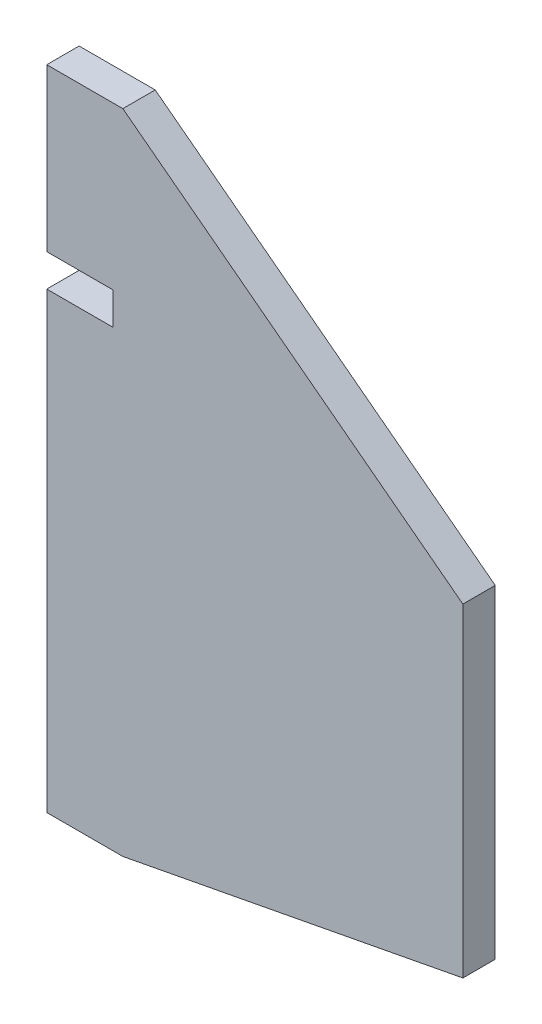
ISO-10303-21;
HEADER;
FILE_DESCRIPTION(('STEP AP214'),'2;1');
FILE_NAME('part.step','',(''),(''),'','','');
FILE_SCHEMA(('AUTOMOTIVE_DESIGN { 1 0 10303 214 1 1 1 1 }'));
ENDSEC;
DATA;
#1=APPLICATION_CONTEXT('core data for automotive mechanical design processes');
#2=APPLICATION_PROTOCOL_DEFINITION('international standard','automotive_design',2000,#1);
#3=PRODUCT_CONTEXT('',#1,'mechanical');
#4=PRODUCT('Part','Part','',(#3));
#5=PRODUCT_RELATED_PRODUCT_CATEGORY('part','',(#4));
#6=PRODUCT_DEFINITION_FORMATION('','',#4);
#7=PRODUCT_DEFINITION_CONTEXT('part definition',#1,'design');
#8=PRODUCT_DEFINITION('design','',#6,#7);
#9=PRODUCT_DEFINITION_SHAPE('','',#8);
#10=(LENGTH_UNIT() NAMED_UNIT(*) SI_UNIT(.MILLI.,.METRE.));
#11=(NAMED_UNIT(*) PLANE_ANGLE_UNIT() SI_UNIT($,.RADIAN.));
#12=(NAMED_UNIT(*) SI_UNIT($,.STERADIAN.) SOLID_ANGLE_UNIT());
#13=UNCERTAINTY_MEASURE_WITH_UNIT(LENGTH_MEASURE(1.E-05),#10,'distance_accuracy_value','');
#14=(GEOMETRIC_REPRESENTATION_CONTEXT(3) GLOBAL_UNCERTAINTY_ASSIGNED_CONTEXT((#13)) GLOBAL_UNIT_ASSIGNED_CONTEXT((#10,
#11,#12)) REPRESENTATION_CONTEXT('',''));
#15=CARTESIAN_POINT('',(0.,0.,0.));
#16=DIRECTION('',(0.,0.,1.));
#17=DIRECTION('',(1.,0.,0.));
#18=AXIS2_PLACEMENT_3D('',#15,#16,#17);
#19=CARTESIAN_POINT('',(0.,101.6,5.08));
#20=DIRECTION('',(1.,0.,0.));
#21=DIRECTION('',(0.,0.,-1.));
#22=AXIS2_PLACEMENT_3D('',#19,#20,#21);
#23=PLANE('',#22);
#24=DIRECTION('',(0.,-1.,0.));
#25=VECTOR('',#24,1.);
#26=CARTESIAN_POINT('',(0.,101.6,0.));
#27=LINE('',#26,#25);
#28=CARTESIAN_POINT('',(0.,101.6,0.));
#29=VERTEX_POINT('',#28);
#30=CARTESIAN_POINT('',(0.,76.2,0.));
#31=VERTEX_POINT('',#30);
#32=EDGE_CURVE('E148',#29,#31,#27,.T.);
#33=ORIENTED_EDGE('',*,*,#32,.T.);
#34=DIRECTION('',(0.,0.,1.));
#35=VECTOR('',#34,1.);
#36=CARTESIAN_POINT('',(0.,76.2,0.));
#37=LINE('',#36,#35);
#38=CARTESIAN_POINT('',(0.,76.2,5.08));
#39=VERTEX_POINT('',#38);
#40=EDGE_CURVE('E189',#31,#39,#37,.T.);
#41=ORIENTED_EDGE('',*,*,#40,.T.);
#42=DIRECTION('',(0.,-1.,0.));
#43=VECTOR('',#42,1.);
#44=CARTESIAN_POINT('',(0.,101.6,5.08));
#45=LINE('',#44,#43);
#46=CARTESIAN_POINT('',(0.,101.6,5.08));
#47=VERTEX_POINT('',#46);
#48=EDGE_CURVE('E187',#47,#39,#45,.T.);
#49=ORIENTED_EDGE('',*,*,#48,.F.);
#50=DIRECTION('',(0.,0.,-1.));
#51=VECTOR('',#50,1.);
#52=CARTESIAN_POINT('',(0.,101.6,5.08));
#53=LINE('',#52,#51);
#54=EDGE_CURVE('E144',#47,#29,#53,.T.);
#55=ORIENTED_EDGE('',*,*,#54,.T.);
#56=EDGE_LOOP('',(#33,#41,#49,#55));
#57=FACE_BOUND('',#56,.T.);
#58=ADVANCED_FACE('F44',(#57),#23,.F.);
#59=CARTESIAN_POINT('',(0.,71.12,5.08));
#60=VERTEX_POINT('',#59);
#61=CARTESIAN_POINT('',(0.,0.,5.08));
#62=VERTEX_POINT('',#61);
#63=EDGE_CURVE('E104',#60,#62,#45,.T.);
#64=ORIENTED_EDGE('',*,*,#63,.F.);
#65=DIRECTION('',(0.,0.,1.));
#66=VECTOR('',#65,1.);
#67=CARTESIAN_POINT('',(0.,71.12,0.));
#68=LINE('',#67,#66);
#69=CARTESIAN_POINT('',(0.,71.12,0.));
#70=VERTEX_POINT('',#69);
#71=EDGE_CURVE('E197',#70,#60,#68,.T.);
#72=ORIENTED_EDGE('',*,*,#71,.F.);
#73=CARTESIAN_POINT('',(0.,0.,0.));
#74=VERTEX_POINT('',#73);
#75=EDGE_CURVE('E153',#70,#74,#27,.T.);
#76=ORIENTED_EDGE('',*,*,#75,.T.);
#77=DIRECTION('',(0.,0.,-1.));
#78=VECTOR('',#77,1.);
#79=CARTESIAN_POINT('',(0.,0.,5.08));
#80=LINE('',#79,#78);
#81=EDGE_CURVE('E11',#62,#74,#80,.T.);
#82=ORIENTED_EDGE('',*,*,#81,.F.);
#83=EDGE_LOOP('',(#64,#72,#76,#82));
#84=FACE_BOUND('',#83,.T.);
#85=ADVANCED_FACE('F46',(#84),#23,.F.);
#86=CARTESIAN_POINT('',(0.,0.,5.08));
#87=DIRECTION('',(0.,1.,0.));
#88=DIRECTION('',(0.,0.,1.));
#89=AXIS2_PLACEMENT_3D('',#86,#87,#88);
#90=PLANE('',#89);
#91=DIRECTION('',(1.,0.,0.));
#92=VECTOR('',#91,1.);
#93=CARTESIAN_POINT('',(0.,0.,0.));
#94=LINE('',#93,#92);
#95=CARTESIAN_POINT('',(11.938,0.,0.));
#96=VERTEX_POINT('',#95);
#97=EDGE_CURVE('E152',#74,#96,#94,.T.);
#98=ORIENTED_EDGE('',*,*,#97,.T.);
#99=DIRECTION('',(0.,0.,-1.));
#100=VECTOR('',#99,1.);
#101=CARTESIAN_POINT('',(11.938,0.,5.08));
#102=LINE('',#101,#100);
#103=CARTESIAN_POINT('',(11.938,0.,5.08));
#104=VERTEX_POINT('',#103);
#105=EDGE_CURVE('E53',#104,#96,#102,.T.);
#106=ORIENTED_EDGE('',*,*,#105,.F.);
#107=DIRECTION('',(1.,0.,0.));
#108=VECTOR('',#107,1.);
#109=CARTESIAN_POINT('',(0.,0.,5.08));
#110=LINE('',#109,#108);
#111=EDGE_CURVE('E191',#62,#104,#110,.T.);
#112=ORIENTED_EDGE('',*,*,#111,.F.);
#113=ORIENTED_EDGE('',*,*,#81,.T.);
#114=EDGE_LOOP('',(#98,#106,#112,#113));
#115=FACE_BOUND('',#114,.T.);
#116=ADVANCED_FACE('F266',(#115),#90,.F.);
#117=CARTESIAN_POINT('',(11.938,0.,5.08));
#118=DIRECTION('',(-0.187112107889995,0.982338566422475,0.));
#119=DIRECTION('',(-0.982338566422475,-0.187112107889995,0.));
#120=AXIS2_PLACEMENT_3D('',#117,#118,#119);
#121=PLANE('',#120);
#122=DIRECTION('',(0.982338566422475,0.187112107889995,0.));
#123=VECTOR('',#122,1.);
#124=CARTESIAN_POINT('',(11.938,0.,0.));
#125=LINE('',#124,#123);
#126=CARTESIAN_POINT('',(65.278,10.16,0.));
#127=VERTEX_POINT('',#126);
#128=EDGE_CURVE('E156',#96,#127,#125,.T.);
#129=ORIENTED_EDGE('',*,*,#128,.T.);
#130=DIRECTION('',(0.,0.,-1.));
#131=VECTOR('',#130,1.);
#132=CARTESIAN_POINT('',(65.278,10.16,5.08));
#133=LINE('',#132,#131);
#134=CARTESIAN_POINT('',(65.278,10.16,5.08));
#135=VERTEX_POINT('',#134);
#136=EDGE_CURVE('E137',#135,#127,#133,.T.);
#137=ORIENTED_EDGE('',*,*,#136,.F.);
#138=DIRECTION('',(0.982338566422475,0.187112107889995,0.));
#139=VECTOR('',#138,1.);
#140=CARTESIAN_POINT('',(11.938,0.,5.08));
#141=LINE('',#140,#139);
#142=EDGE_CURVE('E123',#104,#135,#141,.T.);
#143=ORIENTED_EDGE('',*,*,#142,.F.);
#144=ORIENTED_EDGE('',*,*,#105,.T.);
#145=EDGE_LOOP('',(#129,#137,#143,#144));
#146=FACE_BOUND('',#145,.T.);
#147=ADVANCED_FACE('F176',(#146),#121,.F.);
#148=CARTESIAN_POINT('',(65.278,10.16,5.08));
#149=DIRECTION('',(-1.,0.,0.));
#150=DIRECTION('',(0.,-1.,0.));
#151=AXIS2_PLACEMENT_3D('',#148,#149,#150);
#152=PLANE('',#151);
#153=DIRECTION('',(0.,1.,0.));
#154=VECTOR('',#153,1.);
#155=CARTESIAN_POINT('',(65.278,10.16,0.));
#156=LINE('',#155,#154);
#157=CARTESIAN_POINT('',(65.278,60.96,0.));
#158=VERTEX_POINT('',#157);
#159=EDGE_CURVE('E133',#127,#158,#156,.T.);
#160=ORIENTED_EDGE('',*,*,#159,.T.);
#161=DIRECTION('',(0.,0.,-1.));
#162=VECTOR('',#161,1.);
#163=CARTESIAN_POINT('',(65.278,60.96,5.08));
#164=LINE('',#163,#162);
#165=CARTESIAN_POINT('',(65.278,60.96,5.08));
#166=VERTEX_POINT('',#165);
#167=EDGE_CURVE('E130',#166,#158,#164,.T.);
#168=ORIENTED_EDGE('',*,*,#167,.F.);
#169=DIRECTION('',(0.,1.,0.));
#170=VECTOR('',#169,1.);
#171=CARTESIAN_POINT('',(65.278,10.16,5.08));
#172=LINE('',#171,#170);
#173=EDGE_CURVE('E115',#135,#166,#172,.T.);
#174=ORIENTED_EDGE('',*,*,#173,.F.);
#175=ORIENTED_EDGE('',*,*,#136,.T.);
#176=EDGE_LOOP('',(#160,#168,#174,#175));
#177=FACE_BOUND('',#176,.T.);
#178=ADVANCED_FACE('F131',(#177),#152,.F.);
#179=CARTESIAN_POINT('',(65.278,60.96,5.08));
#180=DIRECTION('',(-0.606043215262856,-0.795431720032499,0.));
#181=DIRECTION('',(0.795431720032499,-0.606043215262856,0.));
#182=AXIS2_PLACEMENT_3D('',#179,#180,#181);
#183=PLANE('',#182);
#184=DIRECTION('',(-0.795431720032499,0.606043215262856,0.));
#185=VECTOR('',#184,1.);
#186=CARTESIAN_POINT('',(65.278,60.96,0.));
#187=LINE('',#186,#185);
#188=CARTESIAN_POINT('',(11.938,101.6,0.));
#189=VERTEX_POINT('',#188);
#190=EDGE_CURVE('E161',#158,#189,#187,.T.);
#191=ORIENTED_EDGE('',*,*,#190,.T.);
#192=DIRECTION('',(0.,0.,-1.));
#193=VECTOR('',#192,1.);
#194=CARTESIAN_POINT('',(11.938,101.6,5.08));
#195=LINE('',#194,#193);
#196=CARTESIAN_POINT('',(11.938,101.6,5.08));
#197=VERTEX_POINT('',#196);
#198=EDGE_CURVE('E138',#197,#189,#195,.T.);
#199=ORIENTED_EDGE('',*,*,#198,.F.);
#200=DIRECTION('',(-0.795431720032499,0.606043215262856,0.));
#201=VECTOR('',#200,1.);
#202=CARTESIAN_POINT('',(65.278,60.96,5.08));
#203=LINE('',#202,#201);
#204=EDGE_CURVE('E120',#166,#197,#203,.T.);
#205=ORIENTED_EDGE('',*,*,#204,.F.);
#206=ORIENTED_EDGE('',*,*,#167,.T.);
#207=EDGE_LOOP('',(#191,#199,#205,#206));
#208=FACE_BOUND('',#207,.T.);
#209=ADVANCED_FACE('F140',(#208),#183,.F.);
#210=CARTESIAN_POINT('',(11.938,101.6,5.08));
#211=DIRECTION('',(0.,-1.,0.));
#212=DIRECTION('',(0.,0.,-1.));
#213=AXIS2_PLACEMENT_3D('',#210,#211,#212);
#214=PLANE('',#213);
#215=DIRECTION('',(-1.,0.,0.));
#216=VECTOR('',#215,1.);
#217=CARTESIAN_POINT('',(11.938,101.6,0.));
#218=LINE('',#217,#216);
#219=EDGE_CURVE('E96',#189,#29,#218,.T.);
#220=ORIENTED_EDGE('',*,*,#219,.T.);
#221=ORIENTED_EDGE('',*,*,#54,.F.);
#222=DIRECTION('',(-1.,0.,0.));
#223=VECTOR('',#222,1.);
#224=CARTESIAN_POINT('',(11.938,101.6,5.08));
#225=LINE('',#224,#223);
#226=EDGE_CURVE('E69',#197,#47,#225,.T.);
#227=ORIENTED_EDGE('',*,*,#226,.F.);
#228=ORIENTED_EDGE('',*,*,#198,.T.);
#229=EDGE_LOOP('',(#220,#221,#227,#228));
#230=FACE_BOUND('',#229,.T.);
#231=ADVANCED_FACE('F183',(#230),#214,.F.);
#232=CARTESIAN_POINT('',(0.,0.,5.08));
#233=DIRECTION('',(0.,0.,1.));
#234=DIRECTION('',(1.,0.,0.));
#235=AXIS2_PLACEMENT_3D('',#232,#233,#234);
#236=PLANE('',#235);
#237=DIRECTION('',(-1.,0.,0.));
#238=VECTOR('',#237,1.);
#239=CARTESIAN_POINT('',(0.,76.2,5.08));
#240=LINE('',#239,#238);
#241=CARTESIAN_POINT('',(10.414,76.2,5.08));
#242=VERTEX_POINT('',#241);
#243=EDGE_CURVE('E212',#242,#39,#240,.T.);
#244=ORIENTED_EDGE('',*,*,#243,.F.);
#245=DIRECTION('',(0.,1.,0.));
#246=VECTOR('',#245,1.);
#247=CARTESIAN_POINT('',(10.414,76.2,5.08));
#248=LINE('',#247,#246);
#249=CARTESIAN_POINT('',(10.414,71.12,5.08));
#250=VERTEX_POINT('',#249);
#251=EDGE_CURVE('E217',#250,#242,#248,.T.);
#252=ORIENTED_EDGE('',*,*,#251,.F.);
#253=DIRECTION('',(1.,0.,0.));
#254=VECTOR('',#253,1.);
#255=CARTESIAN_POINT('',(0.,71.12,5.08));
#256=LINE('',#255,#254);
#257=EDGE_CURVE('E221',#60,#250,#256,.T.);
#258=ORIENTED_EDGE('',*,*,#257,.F.);
#259=ORIENTED_EDGE('',*,*,#63,.T.);
#260=ORIENTED_EDGE('',*,*,#111,.T.);
#261=ORIENTED_EDGE('',*,*,#142,.T.);
#262=ORIENTED_EDGE('',*,*,#173,.T.);
#263=ORIENTED_EDGE('',*,*,#204,.T.);
#264=ORIENTED_EDGE('',*,*,#226,.T.);
#265=ORIENTED_EDGE('',*,*,#48,.T.);
#266=EDGE_LOOP('',(#244,#252,#258,#259,#260,#261,#262,#263,#264,#265));
#267=FACE_BOUND('',#266,.T.);
#268=ADVANCED_FACE('F118',(#267),#236,.T.);
#269=CARTESIAN_POINT('',(0.,0.,0.));
#270=DIRECTION('',(0.,0.,1.));
#271=DIRECTION('',(1.,0.,0.));
#272=AXIS2_PLACEMENT_3D('',#269,#270,#271);
#273=PLANE('',#272);
#274=DIRECTION('',(0.,1.,0.));
#275=VECTOR('',#274,1.);
#276=CARTESIAN_POINT('',(10.414,76.2,0.));
#277=LINE('',#276,#275);
#278=CARTESIAN_POINT('',(10.414,71.12,0.));
#279=VERTEX_POINT('',#278);
#280=CARTESIAN_POINT('',(10.414,76.2,0.));
#281=VERTEX_POINT('',#280);
#282=EDGE_CURVE('E60',#279,#281,#277,.T.);
#283=ORIENTED_EDGE('',*,*,#282,.T.);
#284=DIRECTION('',(-1.,0.,0.));
#285=VECTOR('',#284,1.);
#286=CARTESIAN_POINT('',(0.,76.2,0.));
#287=LINE('',#286,#285);
#288=EDGE_CURVE('E203',#281,#31,#287,.T.);
#289=ORIENTED_EDGE('',*,*,#288,.T.);
#290=ORIENTED_EDGE('',*,*,#32,.F.);
#291=ORIENTED_EDGE('',*,*,#219,.F.);
#292=ORIENTED_EDGE('',*,*,#190,.F.);
#293=ORIENTED_EDGE('',*,*,#159,.F.);
#294=ORIENTED_EDGE('',*,*,#128,.F.);
#295=ORIENTED_EDGE('',*,*,#97,.F.);
#296=ORIENTED_EDGE('',*,*,#75,.F.);
#297=DIRECTION('',(1.,0.,0.));
#298=VECTOR('',#297,1.);
#299=CARTESIAN_POINT('',(0.,71.12,0.));
#300=LINE('',#299,#298);
#301=EDGE_CURVE('E216',#70,#279,#300,.T.);
#302=ORIENTED_EDGE('',*,*,#301,.T.);
#303=EDGE_LOOP('',(#283,#289,#290,#291,#292,#293,#294,#295,#296,#302));
#304=FACE_BOUND('',#303,.T.);
#305=ADVANCED_FACE('F180',(#304),#273,.F.);
#306=CARTESIAN_POINT('',(0.,76.2,0.));
#307=DIRECTION('',(0.,1.,0.));
#308=DIRECTION('',(0.,0.,1.));
#309=AXIS2_PLACEMENT_3D('',#306,#307,#308);
#310=PLANE('',#309);
#311=ORIENTED_EDGE('',*,*,#243,.T.);
#312=ORIENTED_EDGE('',*,*,#40,.F.);
#313=ORIENTED_EDGE('',*,*,#288,.F.);
#314=DIRECTION('',(0.,0.,1.));
#315=VECTOR('',#314,1.);
#316=CARTESIAN_POINT('',(10.414,76.2,0.));
#317=LINE('',#316,#315);
#318=EDGE_CURVE('E206',#281,#242,#317,.T.);
#319=ORIENTED_EDGE('',*,*,#318,.T.);
#320=EDGE_LOOP('',(#311,#312,#313,#319));
#321=FACE_BOUND('',#320,.T.);
#322=ADVANCED_FACE('F250',(#321),#310,.F.);
#323=CARTESIAN_POINT('',(10.414,76.2,0.));
#324=DIRECTION('',(1.,0.,0.));
#325=DIRECTION('',(0.,0.,-1.));
#326=AXIS2_PLACEMENT_3D('',#323,#324,#325);
#327=PLANE('',#326);
#328=ORIENTED_EDGE('',*,*,#251,.T.);
#329=ORIENTED_EDGE('',*,*,#318,.F.);
#330=ORIENTED_EDGE('',*,*,#282,.F.);
#331=DIRECTION('',(0.,0.,1.));
#332=VECTOR('',#331,1.);
#333=CARTESIAN_POINT('',(10.414,71.12,0.));
#334=LINE('',#333,#332);
#335=EDGE_CURVE('E202',#279,#250,#334,.T.);
#336=ORIENTED_EDGE('',*,*,#335,.T.);
#337=EDGE_LOOP('',(#328,#329,#330,#336));
#338=FACE_BOUND('',#337,.T.);
#339=ADVANCED_FACE('F252',(#338),#327,.F.);
#340=CARTESIAN_POINT('',(0.,71.12,0.));
#341=DIRECTION('',(0.,-1.,0.));
#342=DIRECTION('',(0.,0.,-1.));
#343=AXIS2_PLACEMENT_3D('',#340,#341,#342);
#344=PLANE('',#343);
#345=ORIENTED_EDGE('',*,*,#257,.T.);
#346=ORIENTED_EDGE('',*,*,#335,.F.);
#347=ORIENTED_EDGE('',*,*,#301,.F.);
#348=ORIENTED_EDGE('',*,*,#71,.T.);
#349=EDGE_LOOP('',(#345,#346,#347,#348));
#350=FACE_BOUND('',#349,.T.);
#351=ADVANCED_FACE('F237',(#350),#344,.F.);
#352=CLOSED_SHELL('',(#58,#85,#116,#147,#178,#209,#231,#268,#305,#322,#339,#351));
#353=MANIFOLD_SOLID_BREP('B2',#352);
#354=ADVANCED_BREP_SHAPE_REPRESENTATION('',(#18,#353),#14);
#355=SHAPE_DEFINITION_REPRESENTATION(#9,#354);
ENDSEC;
END-ISO-10303-21;
